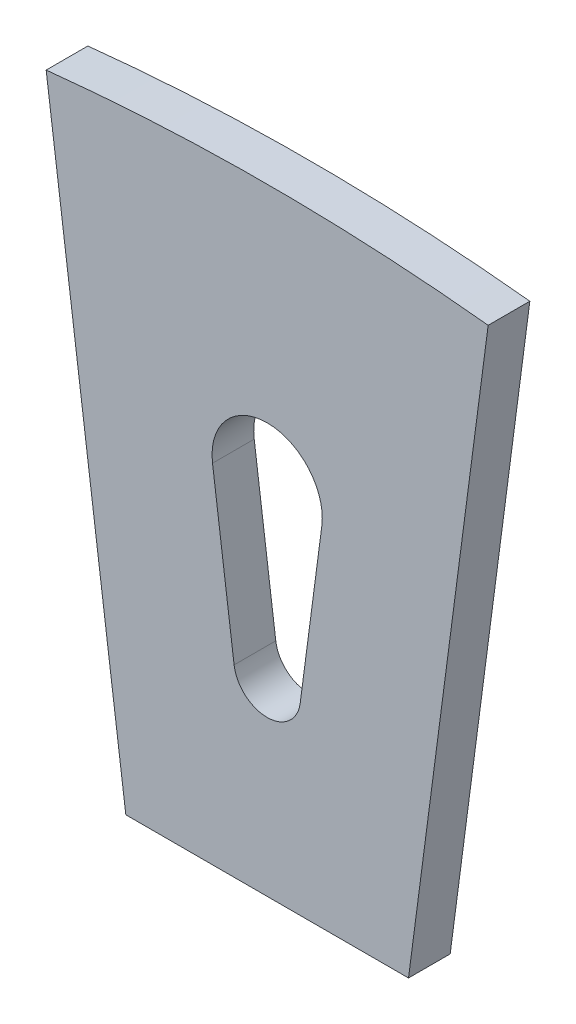
ISO-10303-21;
HEADER;
FILE_DESCRIPTION(('STEP AP214'),'2;1');
FILE_NAME('part.step','',(''),(''),'','','');
FILE_SCHEMA(('AUTOMOTIVE_DESIGN { 1 0 10303 214 1 1 1 1 }'));
ENDSEC;
DATA;
#1=APPLICATION_CONTEXT('core data for automotive mechanical design processes');
#2=APPLICATION_PROTOCOL_DEFINITION('international standard','automotive_design',2000,#1);
#3=PRODUCT_CONTEXT('',#1,'mechanical');
#4=PRODUCT('Part','Part','',(#3));
#5=PRODUCT_RELATED_PRODUCT_CATEGORY('part','',(#4));
#6=PRODUCT_DEFINITION_FORMATION('','',#4);
#7=PRODUCT_DEFINITION_CONTEXT('part definition',#1,'design');
#8=PRODUCT_DEFINITION('design','',#6,#7);
#9=PRODUCT_DEFINITION_SHAPE('','',#8);
#10=(LENGTH_UNIT() NAMED_UNIT(*) SI_UNIT(.MILLI.,.METRE.));
#11=(NAMED_UNIT(*) PLANE_ANGLE_UNIT() SI_UNIT($,.RADIAN.));
#12=(NAMED_UNIT(*) SI_UNIT($,.STERADIAN.) SOLID_ANGLE_UNIT());
#13=UNCERTAINTY_MEASURE_WITH_UNIT(LENGTH_MEASURE(1.E-05),#10,'distance_accuracy_value','');
#14=(GEOMETRIC_REPRESENTATION_CONTEXT(3) GLOBAL_UNCERTAINTY_ASSIGNED_CONTEXT((#13)) GLOBAL_UNIT_ASSIGNED_CONTEXT((#10,
#11,#12)) REPRESENTATION_CONTEXT('',''));
#15=CARTESIAN_POINT('',(0.,0.,0.));
#16=DIRECTION('',(0.,0.,1.));
#17=DIRECTION('',(1.,0.,0.));
#18=AXIS2_PLACEMENT_3D('',#15,#16,#17);
#19=CARTESIAN_POINT('',(0.,0.,2.5));
#20=DIRECTION('',(0.,0.,-1.));
#21=DIRECTION('',(-1.,0.,0.));
#22=AXIS2_PLACEMENT_3D('',#19,#20,#21);
#23=PLANE('',#22);
#24=CARTESIAN_POINT('',(0.,0.,2.5));
#25=DIRECTION('',(0.,0.,-1.));
#26=DIRECTION('',(-1.,0.,0.));
#27=AXIS2_PLACEMENT_3D('',#24,#25,#26);
#28=CIRCLE('',#27,125.);
#29=CARTESIAN_POINT('',(-13.2563820997667,124.29508571792,2.5));
#30=VERTEX_POINT('',#29);
#31=CARTESIAN_POINT('',(13.2563820997667,124.29508571792,2.5));
#32=VERTEX_POINT('',#31);
#33=EDGE_CURVE('E134',#30,#32,#28,.T.);
#34=ORIENTED_EDGE('',*,*,#33,.F.);
#35=DIRECTION('',(0.130526192220053,-0.99144486137381,0.));
#36=VECTOR('',#35,1.);
#37=CARTESIAN_POINT('',(-13.2563820997667,124.29508571792,2.5));
#38=LINE('',#37,#36);
#39=CARTESIAN_POINT('',(-8.47804341485396,88.,2.5));
#40=VERTEX_POINT('',#39);
#41=EDGE_CURVE('E143',#30,#40,#38,.T.);
#42=ORIENTED_EDGE('',*,*,#41,.T.);
#43=DIRECTION('',(1.,0.,0.));
#44=VECTOR('',#43,1.);
#45=CARTESIAN_POINT('',(-8.47804341485396,88.,2.5));
#46=LINE('',#45,#44);
#47=CARTESIAN_POINT('',(8.47804341485396,88.,2.5));
#48=VERTEX_POINT('',#47);
#49=EDGE_CURVE('E141',#40,#48,#46,.T.);
#50=ORIENTED_EDGE('',*,*,#49,.T.);
#51=DIRECTION('',(-0.130526192220052,-0.99144486137381,0.));
#52=VECTOR('',#51,1.);
#53=CARTESIAN_POINT('',(13.2563820997667,124.29508571792,2.5));
#54=LINE('',#53,#52);
#55=EDGE_CURVE('E137',#32,#48,#54,.T.);
#56=ORIENTED_EDGE('',*,*,#55,.F.);
#57=EDGE_LOOP('',(#34,#42,#50,#56));
#58=FACE_BOUND('',#57,.T.);
#59=CARTESIAN_POINT('',(0.,109.29508571792,2.5));
#60=DIRECTION('',(0.,0.,1.));
#61=DIRECTION('',(1.,0.,0.));
#62=AXIS2_PLACEMENT_3D('',#59,#60,#61);
#63=CIRCLE('',#62,3.30526192220055);
#64=CARTESIAN_POINT('',(3.27698494826025,108.863662464925,2.5));
#65=VERTEX_POINT('',#64);
#66=CARTESIAN_POINT('',(-3.27698494826026,108.863662464925,2.5));
#67=VERTEX_POINT('',#66);
#68=EDGE_CURVE('E99',#65,#67,#63,.T.);
#69=ORIENTED_EDGE('',*,*,#68,.F.);
#70=DIRECTION('',(-0.130526192220055,-0.99144486137381,0.));
#71=VECTOR('',#70,1.);
#72=CARTESIAN_POINT('',(3.27698494826025,108.863662464925,2.5));
#73=LINE('',#72,#71);
#74=CARTESIAN_POINT('',(1.98288972274762,99.0340333334795,2.5));
#75=VERTEX_POINT('',#74);
#76=EDGE_CURVE('E121',#65,#75,#73,.T.);
#77=ORIENTED_EDGE('',*,*,#76,.T.);
#78=CARTESIAN_POINT('',(0.,99.2950857179196,2.5));
#79=DIRECTION('',(0.,0.,1.));
#80=DIRECTION('',(1.,0.,0.));
#81=AXIS2_PLACEMENT_3D('',#78,#79,#80);
#82=CIRCLE('',#81,2.);
#83=CARTESIAN_POINT('',(-1.98288972274762,99.0340333334795,2.5));
#84=VERTEX_POINT('',#83);
#85=EDGE_CURVE('E119',#84,#75,#82,.T.);
#86=ORIENTED_EDGE('',*,*,#85,.F.);
#87=DIRECTION('',(0.130526192220055,-0.99144486137381,0.));
#88=VECTOR('',#87,1.);
#89=CARTESIAN_POINT('',(-3.27698494826026,108.863662464925,2.5));
#90=LINE('',#89,#88);
#91=EDGE_CURVE('E107',#67,#84,#90,.T.);
#92=ORIENTED_EDGE('',*,*,#91,.F.);
#93=EDGE_LOOP('',(#69,#77,#86,#92));
#94=FACE_BOUND('',#93,.T.);
#95=ADVANCED_FACE('F33',(#58,#94),#23,.F.);
#96=CARTESIAN_POINT('',(0.,0.,0.));
#97=DIRECTION('',(0.,0.,-1.));
#98=DIRECTION('',(-1.,0.,0.));
#99=AXIS2_PLACEMENT_3D('',#96,#97,#98);
#100=PLANE('',#99);
#101=CARTESIAN_POINT('',(0.,0.,0.));
#102=DIRECTION('',(0.,0.,-1.));
#103=DIRECTION('',(-1.,0.,0.));
#104=AXIS2_PLACEMENT_3D('',#101,#102,#103);
#105=CIRCLE('',#104,125.);
#106=CARTESIAN_POINT('',(-13.2563820997667,124.29508571792,0.));
#107=VERTEX_POINT('',#106);
#108=CARTESIAN_POINT('',(13.2563820997667,124.29508571792,0.));
#109=VERTEX_POINT('',#108);
#110=EDGE_CURVE('E115',#107,#109,#105,.T.);
#111=ORIENTED_EDGE('',*,*,#110,.T.);
#112=DIRECTION('',(-0.130526192220052,-0.99144486137381,0.));
#113=VECTOR('',#112,1.);
#114=CARTESIAN_POINT('',(13.2563820997667,124.29508571792,0.));
#115=LINE('',#114,#113);
#116=CARTESIAN_POINT('',(8.47804341485396,88.,0.));
#117=VERTEX_POINT('',#116);
#118=EDGE_CURVE('E147',#109,#117,#115,.T.);
#119=ORIENTED_EDGE('',*,*,#118,.T.);
#120=DIRECTION('',(1.,0.,0.));
#121=VECTOR('',#120,1.);
#122=CARTESIAN_POINT('',(-8.47804341485396,88.,0.));
#123=LINE('',#122,#121);
#124=CARTESIAN_POINT('',(-8.47804341485396,88.,0.));
#125=VERTEX_POINT('',#124);
#126=EDGE_CURVE('E150',#125,#117,#123,.T.);
#127=ORIENTED_EDGE('',*,*,#126,.F.);
#128=DIRECTION('',(0.130526192220053,-0.99144486137381,0.));
#129=VECTOR('',#128,1.);
#130=CARTESIAN_POINT('',(-13.2563820997667,124.29508571792,0.));
#131=LINE('',#130,#129);
#132=EDGE_CURVE('E138',#107,#125,#131,.T.);
#133=ORIENTED_EDGE('',*,*,#132,.F.);
#134=EDGE_LOOP('',(#111,#119,#127,#133));
#135=FACE_BOUND('',#134,.T.);
#136=DIRECTION('',(-0.130526192220055,-0.99144486137381,0.));
#137=VECTOR('',#136,1.);
#138=CARTESIAN_POINT('',(3.27698494826025,108.863662464925,0.));
#139=LINE('',#138,#137);
#140=CARTESIAN_POINT('',(3.27698494826025,108.863662464925,0.));
#141=VERTEX_POINT('',#140);
#142=CARTESIAN_POINT('',(1.98288972274762,99.0340333334795,0.));
#143=VERTEX_POINT('',#142);
#144=EDGE_CURVE('E108',#141,#143,#139,.T.);
#145=ORIENTED_EDGE('',*,*,#144,.F.);
#146=CARTESIAN_POINT('',(0.,109.29508571792,0.));
#147=DIRECTION('',(0.,0.,1.));
#148=DIRECTION('',(1.,0.,0.));
#149=AXIS2_PLACEMENT_3D('',#146,#147,#148);
#150=CIRCLE('',#149,3.30526192220055);
#151=CARTESIAN_POINT('',(-3.27698494826026,108.863662464925,0.));
#152=VERTEX_POINT('',#151);
#153=EDGE_CURVE('E58',#141,#152,#150,.T.);
#154=ORIENTED_EDGE('',*,*,#153,.T.);
#155=DIRECTION('',(0.130526192220055,-0.99144486137381,0.));
#156=VECTOR('',#155,1.);
#157=CARTESIAN_POINT('',(-3.27698494826026,108.863662464925,0.));
#158=LINE('',#157,#156);
#159=CARTESIAN_POINT('',(-1.98288972274762,99.0340333334795,0.));
#160=VERTEX_POINT('',#159);
#161=EDGE_CURVE('E114',#152,#160,#158,.T.);
#162=ORIENTED_EDGE('',*,*,#161,.T.);
#163=CARTESIAN_POINT('',(0.,99.2950857179196,0.));
#164=DIRECTION('',(0.,0.,1.));
#165=DIRECTION('',(1.,0.,0.));
#166=AXIS2_PLACEMENT_3D('',#163,#164,#165);
#167=CIRCLE('',#166,2.);
#168=EDGE_CURVE('E127',#160,#143,#167,.T.);
#169=ORIENTED_EDGE('',*,*,#168,.T.);
#170=EDGE_LOOP('',(#145,#154,#162,#169));
#171=FACE_BOUND('',#170,.T.);
#172=ADVANCED_FACE('F167',(#135,#171),#100,.T.);
#173=CARTESIAN_POINT('',(0.,0.,2.5));
#174=DIRECTION('',(0.,0.,-1.));
#175=DIRECTION('',(-1.,0.,0.));
#176=AXIS2_PLACEMENT_3D('',#173,#174,#175);
#177=CYLINDRICAL_SURFACE('',#176,125.);
#178=ORIENTED_EDGE('',*,*,#110,.F.);
#179=DIRECTION('',(0.,0.,-1.));
#180=VECTOR('',#179,1.);
#181=CARTESIAN_POINT('',(-13.2563820997667,124.29508571792,2.5));
#182=LINE('',#181,#180);
#183=EDGE_CURVE('E11',#30,#107,#182,.T.);
#184=ORIENTED_EDGE('',*,*,#183,.F.);
#185=ORIENTED_EDGE('',*,*,#33,.T.);
#186=DIRECTION('',(0.,0.,-1.));
#187=VECTOR('',#186,1.);
#188=CARTESIAN_POINT('',(13.2563820997667,124.29508571792,2.5));
#189=LINE('',#188,#187);
#190=EDGE_CURVE('E37',#32,#109,#189,.T.);
#191=ORIENTED_EDGE('',*,*,#190,.T.);
#192=EDGE_LOOP('',(#178,#184,#185,#191));
#193=FACE_BOUND('',#192,.T.);
#194=ADVANCED_FACE('F35',(#193),#177,.T.);
#195=CARTESIAN_POINT('',(-13.2563820997667,124.29508571792,2.5));
#196=DIRECTION('',(0.99144486137381,0.130526192220053,0.));
#197=DIRECTION('',(-0.130526192220053,0.99144486137381,0.));
#198=AXIS2_PLACEMENT_3D('',#195,#196,#197);
#199=PLANE('',#198);
#200=ORIENTED_EDGE('',*,*,#132,.T.);
#201=DIRECTION('',(0.,0.,-1.));
#202=VECTOR('',#201,1.);
#203=CARTESIAN_POINT('',(-8.47804341485396,88.,2.5));
#204=LINE('',#203,#202);
#205=EDGE_CURVE('E42',#40,#125,#204,.T.);
#206=ORIENTED_EDGE('',*,*,#205,.F.);
#207=ORIENTED_EDGE('',*,*,#41,.F.);
#208=ORIENTED_EDGE('',*,*,#183,.T.);
#209=EDGE_LOOP('',(#200,#206,#207,#208));
#210=FACE_BOUND('',#209,.T.);
#211=ADVANCED_FACE('F171',(#210),#199,.F.);
#212=CARTESIAN_POINT('',(-8.47804341485396,88.,2.5));
#213=DIRECTION('',(0.,1.,0.));
#214=DIRECTION('',(0.,0.,1.));
#215=AXIS2_PLACEMENT_3D('',#212,#213,#214);
#216=PLANE('',#215);
#217=ORIENTED_EDGE('',*,*,#126,.T.);
#218=DIRECTION('',(0.,0.,-1.));
#219=VECTOR('',#218,1.);
#220=CARTESIAN_POINT('',(8.47804341485396,88.,2.5));
#221=LINE('',#220,#219);
#222=EDGE_CURVE('E155',#48,#117,#221,.T.);
#223=ORIENTED_EDGE('',*,*,#222,.F.);
#224=ORIENTED_EDGE('',*,*,#49,.F.);
#225=ORIENTED_EDGE('',*,*,#205,.T.);
#226=EDGE_LOOP('',(#217,#223,#224,#225));
#227=FACE_BOUND('',#226,.T.);
#228=ADVANCED_FACE('F175',(#227),#216,.F.);
#229=CARTESIAN_POINT('',(13.2563820997667,124.29508571792,2.5));
#230=DIRECTION('',(0.99144486137381,-0.130526192220052,0.));
#231=DIRECTION('',(0.130526192220052,0.99144486137381,0.));
#232=AXIS2_PLACEMENT_3D('',#229,#230,#231);
#233=PLANE('',#232);
#234=ORIENTED_EDGE('',*,*,#118,.F.);
#235=ORIENTED_EDGE('',*,*,#190,.F.);
#236=ORIENTED_EDGE('',*,*,#55,.T.);
#237=ORIENTED_EDGE('',*,*,#222,.T.);
#238=EDGE_LOOP('',(#234,#235,#236,#237));
#239=FACE_BOUND('',#238,.T.);
#240=ADVANCED_FACE('F163',(#239),#233,.T.);
#241=CARTESIAN_POINT('',(0.,109.29508571792,2.5));
#242=DIRECTION('',(0.,0.,-1.));
#243=DIRECTION('',(-1.,0.,0.));
#244=AXIS2_PLACEMENT_3D('',#241,#242,#243);
#245=CYLINDRICAL_SURFACE('',#244,3.30526192220055);
#246=ORIENTED_EDGE('',*,*,#153,.F.);
#247=DIRECTION('',(0.,0.,-1.));
#248=VECTOR('',#247,1.);
#249=CARTESIAN_POINT('',(3.27698494826025,108.863662464925,2.5));
#250=LINE('',#249,#248);
#251=EDGE_CURVE('E103',#65,#141,#250,.T.);
#252=ORIENTED_EDGE('',*,*,#251,.F.);
#253=ORIENTED_EDGE('',*,*,#68,.T.);
#254=DIRECTION('',(0.,0.,-1.));
#255=VECTOR('',#254,1.);
#256=CARTESIAN_POINT('',(-3.27698494826026,108.863662464925,2.5));
#257=LINE('',#256,#255);
#258=EDGE_CURVE('E102',#67,#152,#257,.T.);
#259=ORIENTED_EDGE('',*,*,#258,.T.);
#260=EDGE_LOOP('',(#246,#252,#253,#259));
#261=FACE_BOUND('',#260,.T.);
#262=ADVANCED_FACE('F101',(#261),#245,.F.);
#263=CARTESIAN_POINT('',(-3.27698494826026,108.863662464925,2.5));
#264=DIRECTION('',(0.99144486137381,0.130526192220055,0.));
#265=DIRECTION('',(-0.130526192220055,0.99144486137381,0.));
#266=AXIS2_PLACEMENT_3D('',#263,#264,#265);
#267=PLANE('',#266);
#268=ORIENTED_EDGE('',*,*,#161,.F.);
#269=ORIENTED_EDGE('',*,*,#258,.F.);
#270=ORIENTED_EDGE('',*,*,#91,.T.);
#271=DIRECTION('',(0.,0.,-1.));
#272=VECTOR('',#271,1.);
#273=CARTESIAN_POINT('',(-1.98288972274762,99.0340333334795,2.5));
#274=LINE('',#273,#272);
#275=EDGE_CURVE('E116',#84,#160,#274,.T.);
#276=ORIENTED_EDGE('',*,*,#275,.T.);
#277=EDGE_LOOP('',(#268,#269,#270,#276));
#278=FACE_BOUND('',#277,.T.);
#279=ADVANCED_FACE('F111',(#278),#267,.T.);
#280=CARTESIAN_POINT('',(0.,99.2950857179196,2.5));
#281=DIRECTION('',(0.,0.,-1.));
#282=DIRECTION('',(-1.,0.,0.));
#283=AXIS2_PLACEMENT_3D('',#280,#281,#282);
#284=CYLINDRICAL_SURFACE('',#283,2.);
#285=ORIENTED_EDGE('',*,*,#168,.F.);
#286=ORIENTED_EDGE('',*,*,#275,.F.);
#287=ORIENTED_EDGE('',*,*,#85,.T.);
#288=DIRECTION('',(0.,0.,-1.));
#289=VECTOR('',#288,1.);
#290=CARTESIAN_POINT('',(1.98288972274762,99.0340333334795,2.5));
#291=LINE('',#290,#289);
#292=EDGE_CURVE('E50',#75,#143,#291,.T.);
#293=ORIENTED_EDGE('',*,*,#292,.T.);
#294=EDGE_LOOP('',(#285,#286,#287,#293));
#295=FACE_BOUND('',#294,.T.);
#296=ADVANCED_FACE('F196',(#295),#284,.F.);
#297=CARTESIAN_POINT('',(3.27698494826025,108.863662464925,2.5));
#298=DIRECTION('',(0.99144486137381,-0.130526192220055,0.));
#299=DIRECTION('',(0.130526192220055,0.99144486137381,0.));
#300=AXIS2_PLACEMENT_3D('',#297,#298,#299);
#301=PLANE('',#300);
#302=ORIENTED_EDGE('',*,*,#144,.T.);
#303=ORIENTED_EDGE('',*,*,#292,.F.);
#304=ORIENTED_EDGE('',*,*,#76,.F.);
#305=ORIENTED_EDGE('',*,*,#251,.T.);
#306=EDGE_LOOP('',(#302,#303,#304,#305));
#307=FACE_BOUND('',#306,.T.);
#308=ADVANCED_FACE('F200',(#307),#301,.F.);
#309=CLOSED_SHELL('',(#95,#172,#194,#211,#228,#240,#262,#279,#296,#308));
#310=MANIFOLD_SOLID_BREP('B2',#309);
#311=ADVANCED_BREP_SHAPE_REPRESENTATION('',(#18,#310),#14);
#312=SHAPE_DEFINITION_REPRESENTATION(#9,#311);
ENDSEC;
END-ISO-10303-21;
